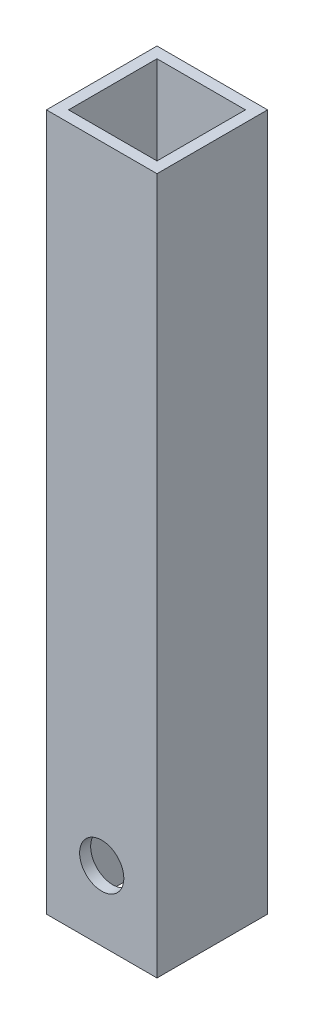
ISO-10303-21;
HEADER;
FILE_DESCRIPTION(('STEP AP214'),'2;1');
FILE_NAME('part.step','',(''),(''),'','','');
FILE_SCHEMA(('AUTOMOTIVE_DESIGN { 1 0 10303 214 1 1 1 1 }'));
ENDSEC;
DATA;
#1=APPLICATION_CONTEXT('core data for automotive mechanical design processes');
#2=APPLICATION_PROTOCOL_DEFINITION('international standard','automotive_design',2000,#1);
#3=PRODUCT_CONTEXT('',#1,'mechanical');
#4=PRODUCT('Part','Part','',(#3));
#5=PRODUCT_RELATED_PRODUCT_CATEGORY('part','',(#4));
#6=PRODUCT_DEFINITION_FORMATION('','',#4);
#7=PRODUCT_DEFINITION_CONTEXT('part definition',#1,'design');
#8=PRODUCT_DEFINITION('design','',#6,#7);
#9=PRODUCT_DEFINITION_SHAPE('','',#8);
#10=(LENGTH_UNIT() NAMED_UNIT(*) SI_UNIT(.MILLI.,.METRE.));
#11=(NAMED_UNIT(*) PLANE_ANGLE_UNIT() SI_UNIT($,.RADIAN.));
#12=(NAMED_UNIT(*) SI_UNIT($,.STERADIAN.) SOLID_ANGLE_UNIT());
#13=UNCERTAINTY_MEASURE_WITH_UNIT(LENGTH_MEASURE(1.E-05),#10,'distance_accuracy_value','');
#14=(GEOMETRIC_REPRESENTATION_CONTEXT(3) GLOBAL_UNCERTAINTY_ASSIGNED_CONTEXT((#13)) GLOBAL_UNIT_ASSIGNED_CONTEXT((#10,
#11,#12)) REPRESENTATION_CONTEXT('',''));
#15=CARTESIAN_POINT('',(0.,0.,0.));
#16=DIRECTION('',(0.,0.,1.));
#17=DIRECTION('',(1.,0.,0.));
#18=AXIS2_PLACEMENT_3D('',#15,#16,#17);
#19=CARTESIAN_POINT('',(1.984375,12.5,-1.984375));
#20=DIRECTION('',(-1.,0.,0.));
#21=DIRECTION('',(0.,0.,1.));
#22=AXIS2_PLACEMENT_3D('',#19,#20,#21);
#23=PLANE('',#22);
#24=DIRECTION('',(0.,0.,-1.));
#25=VECTOR('',#24,1.);
#26=CARTESIAN_POINT('',(1.984375,-12.5,-1.984375));
#27=LINE('',#26,#25);
#28=CARTESIAN_POINT('',(1.984375,-12.5,1.984375));
#29=VERTEX_POINT('',#28);
#30=CARTESIAN_POINT('',(1.984375,-12.5,-1.984375));
#31=VERTEX_POINT('',#30);
#32=EDGE_CURVE('E135',#29,#31,#27,.T.);
#33=ORIENTED_EDGE('',*,*,#32,.T.);
#34=DIRECTION('',(0.,-1.,0.));
#35=VECTOR('',#34,1.);
#36=CARTESIAN_POINT('',(1.984375,12.5,-1.984375));
#37=LINE('',#36,#35);
#38=CARTESIAN_POINT('',(1.984375,12.5,-1.984375));
#39=VERTEX_POINT('',#38);
#40=EDGE_CURVE('E11',#39,#31,#37,.T.);
#41=ORIENTED_EDGE('',*,*,#40,.F.);
#42=DIRECTION('',(0.,0.,-1.));
#43=VECTOR('',#42,1.);
#44=CARTESIAN_POINT('',(1.984375,12.5,-1.984375));
#45=LINE('',#44,#43);
#46=CARTESIAN_POINT('',(1.984375,12.5,1.984375));
#47=VERTEX_POINT('',#46);
#48=EDGE_CURVE('E139',#47,#39,#45,.T.);
#49=ORIENTED_EDGE('',*,*,#48,.F.);
#50=DIRECTION('',(0.,-1.,0.));
#51=VECTOR('',#50,1.);
#52=CARTESIAN_POINT('',(1.984375,12.5,1.984375));
#53=LINE('',#52,#51);
#54=EDGE_CURVE('E149',#47,#29,#53,.T.);
#55=ORIENTED_EDGE('',*,*,#54,.T.);
#56=EDGE_LOOP('',(#33,#41,#49,#55));
#57=FACE_BOUND('',#56,.T.);
#58=ADVANCED_FACE('F34',(#57),#23,.F.);
#59=CARTESIAN_POINT('',(-1.984375,12.5,-1.984375));
#60=DIRECTION('',(0.,0.,1.));
#61=DIRECTION('',(1.,0.,0.));
#62=AXIS2_PLACEMENT_3D('',#59,#60,#61);
#63=PLANE('',#62);
#64=CARTESIAN_POINT('',(0.,-10.,-1.984375));
#65=DIRECTION('',(0.,0.,1.));
#66=DIRECTION('',(1.,0.,0.));
#67=AXIS2_PLACEMENT_3D('',#64,#65,#66);
#68=CIRCLE('',#67,0.79375);
#69=CARTESIAN_POINT('',(0.79375,-10.,-1.984375));
#70=VERTEX_POINT('',#69);
#71=EDGE_CURVE('E226',#70,#70,#68,.T.);
#72=ORIENTED_EDGE('',*,*,#71,.T.);
#73=EDGE_LOOP('',(#72));
#74=FACE_BOUND('',#73,.T.);
#75=DIRECTION('',(-1.,0.,0.));
#76=VECTOR('',#75,1.);
#77=CARTESIAN_POINT('',(-1.984375,-12.5,-1.984375));
#78=LINE('',#77,#76);
#79=CARTESIAN_POINT('',(-1.984375,-12.5,-1.984375));
#80=VERTEX_POINT('',#79);
#81=EDGE_CURVE('E152',#31,#80,#78,.T.);
#82=ORIENTED_EDGE('',*,*,#81,.T.);
#83=DIRECTION('',(0.,-1.,0.));
#84=VECTOR('',#83,1.);
#85=CARTESIAN_POINT('',(-1.984375,12.5,-1.984375));
#86=LINE('',#85,#84);
#87=CARTESIAN_POINT('',(-1.984375,12.5,-1.984375));
#88=VERTEX_POINT('',#87);
#89=EDGE_CURVE('E42',#88,#80,#86,.T.);
#90=ORIENTED_EDGE('',*,*,#89,.F.);
#91=DIRECTION('',(-1.,0.,0.));
#92=VECTOR('',#91,1.);
#93=CARTESIAN_POINT('',(-1.984375,12.5,-1.984375));
#94=LINE('',#93,#92);
#95=EDGE_CURVE('E142',#39,#88,#94,.T.);
#96=ORIENTED_EDGE('',*,*,#95,.F.);
#97=ORIENTED_EDGE('',*,*,#40,.T.);
#98=EDGE_LOOP('',(#82,#90,#96,#97));
#99=FACE_BOUND('',#98,.T.);
#100=ADVANCED_FACE('F181',(#74,#99),#63,.F.);
#101=CARTESIAN_POINT('',(-1.984375,12.5,-1.984375));
#102=DIRECTION('',(1.,0.,0.));
#103=DIRECTION('',(0.,0.,-1.));
#104=AXIS2_PLACEMENT_3D('',#101,#102,#103);
#105=PLANE('',#104);
#106=DIRECTION('',(0.,0.,1.));
#107=VECTOR('',#106,1.);
#108=CARTESIAN_POINT('',(-1.984375,-12.5,-1.984375));
#109=LINE('',#108,#107);
#110=CARTESIAN_POINT('',(-1.984375,-12.5,1.984375));
#111=VERTEX_POINT('',#110);
#112=EDGE_CURVE('E154',#80,#111,#109,.T.);
#113=ORIENTED_EDGE('',*,*,#112,.T.);
#114=DIRECTION('',(0.,-1.,0.));
#115=VECTOR('',#114,1.);
#116=CARTESIAN_POINT('',(-1.984375,12.5,1.984375));
#117=LINE('',#116,#115);
#118=CARTESIAN_POINT('',(-1.984375,12.5,1.984375));
#119=VERTEX_POINT('',#118);
#120=EDGE_CURVE('E159',#119,#111,#117,.T.);
#121=ORIENTED_EDGE('',*,*,#120,.F.);
#122=DIRECTION('',(0.,0.,1.));
#123=VECTOR('',#122,1.);
#124=CARTESIAN_POINT('',(-1.984375,12.5,-1.984375));
#125=LINE('',#124,#123);
#126=EDGE_CURVE('E145',#88,#119,#125,.T.);
#127=ORIENTED_EDGE('',*,*,#126,.F.);
#128=ORIENTED_EDGE('',*,*,#89,.T.);
#129=EDGE_LOOP('',(#113,#121,#127,#128));
#130=FACE_BOUND('',#129,.T.);
#131=ADVANCED_FACE('F167',(#130),#105,.F.);
#132=CARTESIAN_POINT('',(-1.984375,12.5,1.984375));
#133=DIRECTION('',(0.,0.,-1.));
#134=DIRECTION('',(-1.,0.,0.));
#135=AXIS2_PLACEMENT_3D('',#132,#133,#134);
#136=PLANE('',#135);
#137=CARTESIAN_POINT('',(0.,-10.,1.984375));
#138=DIRECTION('',(0.,0.,1.));
#139=DIRECTION('',(1.,0.,0.));
#140=AXIS2_PLACEMENT_3D('',#137,#138,#139);
#141=CIRCLE('',#140,0.79375);
#142=CARTESIAN_POINT('',(0.79375,-10.,1.984375));
#143=VERTEX_POINT('',#142);
#144=EDGE_CURVE('E222',#143,#143,#141,.T.);
#145=ORIENTED_EDGE('',*,*,#144,.F.);
#146=EDGE_LOOP('',(#145));
#147=FACE_BOUND('',#146,.T.);
#148=DIRECTION('',(1.,0.,0.));
#149=VECTOR('',#148,1.);
#150=CARTESIAN_POINT('',(-1.984375,-12.5,1.984375));
#151=LINE('',#150,#149);
#152=EDGE_CURVE('E143',#111,#29,#151,.T.);
#153=ORIENTED_EDGE('',*,*,#152,.T.);
#154=ORIENTED_EDGE('',*,*,#54,.F.);
#155=DIRECTION('',(1.,0.,0.));
#156=VECTOR('',#155,1.);
#157=CARTESIAN_POINT('',(-1.984375,12.5,1.984375));
#158=LINE('',#157,#156);
#159=EDGE_CURVE('E147',#119,#47,#158,.T.);
#160=ORIENTED_EDGE('',*,*,#159,.F.);
#161=ORIENTED_EDGE('',*,*,#120,.T.);
#162=EDGE_LOOP('',(#153,#154,#160,#161));
#163=FACE_BOUND('',#162,.T.);
#164=ADVANCED_FACE('F174',(#147,#163),#136,.F.);
#165=CARTESIAN_POINT('',(0.,12.5,0.));
#166=DIRECTION('',(0.,1.,0.));
#167=DIRECTION('',(0.,0.,1.));
#168=AXIS2_PLACEMENT_3D('',#165,#166,#167);
#169=PLANE('',#168);
#170=DIRECTION('',(0.,0.,-1.));
#171=VECTOR('',#170,1.);
#172=CARTESIAN_POINT('',(1.5875,12.5,-1.5875));
#173=LINE('',#172,#171);
#174=CARTESIAN_POINT('',(1.5875,12.5,1.5875));
#175=VERTEX_POINT('',#174);
#176=CARTESIAN_POINT('',(1.5875,12.5,-1.5875));
#177=VERTEX_POINT('',#176);
#178=EDGE_CURVE('E49',#175,#177,#173,.T.);
#179=ORIENTED_EDGE('',*,*,#178,.F.);
#180=DIRECTION('',(1.,0.,0.));
#181=VECTOR('',#180,1.);
#182=CARTESIAN_POINT('',(-1.5875,12.5,1.5875));
#183=LINE('',#182,#181);
#184=CARTESIAN_POINT('',(-1.5875,12.5,1.5875));
#185=VERTEX_POINT('',#184);
#186=EDGE_CURVE('E117',#185,#175,#183,.T.);
#187=ORIENTED_EDGE('',*,*,#186,.F.);
#188=DIRECTION('',(0.,0.,1.));
#189=VECTOR('',#188,1.);
#190=CARTESIAN_POINT('',(-1.5875,12.5,-1.5875));
#191=LINE('',#190,#189);
#192=CARTESIAN_POINT('',(-1.5875,12.5,-1.5875));
#193=VERTEX_POINT('',#192);
#194=EDGE_CURVE('E120',#193,#185,#191,.T.);
#195=ORIENTED_EDGE('',*,*,#194,.F.);
#196=DIRECTION('',(-1.,0.,0.));
#197=VECTOR('',#196,1.);
#198=CARTESIAN_POINT('',(-1.5875,12.5,-1.5875));
#199=LINE('',#198,#197);
#200=EDGE_CURVE('E129',#177,#193,#199,.T.);
#201=ORIENTED_EDGE('',*,*,#200,.F.);
#202=EDGE_LOOP('',(#179,#187,#195,#201));
#203=FACE_BOUND('',#202,.T.);
#204=ORIENTED_EDGE('',*,*,#48,.T.);
#205=ORIENTED_EDGE('',*,*,#95,.T.);
#206=ORIENTED_EDGE('',*,*,#126,.T.);
#207=ORIENTED_EDGE('',*,*,#159,.T.);
#208=EDGE_LOOP('',(#204,#205,#206,#207));
#209=FACE_BOUND('',#208,.T.);
#210=ADVANCED_FACE('F180',(#203,#209),#169,.T.);
#211=CARTESIAN_POINT('',(0.,-12.5,0.));
#212=DIRECTION('',(0.,1.,0.));
#213=DIRECTION('',(0.,0.,1.));
#214=AXIS2_PLACEMENT_3D('',#211,#212,#213);
#215=PLANE('',#214);
#216=DIRECTION('',(1.,0.,0.));
#217=VECTOR('',#216,1.);
#218=CARTESIAN_POINT('',(-1.5875,-12.5,1.5875));
#219=LINE('',#218,#217);
#220=CARTESIAN_POINT('',(-1.5875,-12.5,1.5875));
#221=VERTEX_POINT('',#220);
#222=CARTESIAN_POINT('',(1.5875,-12.5,1.5875));
#223=VERTEX_POINT('',#222);
#224=EDGE_CURVE('E107',#221,#223,#219,.T.);
#225=ORIENTED_EDGE('',*,*,#224,.T.);
#226=DIRECTION('',(0.,0.,-1.));
#227=VECTOR('',#226,1.);
#228=CARTESIAN_POINT('',(1.5875,-12.5,-1.5875));
#229=LINE('',#228,#227);
#230=CARTESIAN_POINT('',(1.5875,-12.5,-1.5875));
#231=VERTEX_POINT('',#230);
#232=EDGE_CURVE('E101',#223,#231,#229,.T.);
#233=ORIENTED_EDGE('',*,*,#232,.T.);
#234=DIRECTION('',(-1.,0.,0.));
#235=VECTOR('',#234,1.);
#236=CARTESIAN_POINT('',(-1.5875,-12.5,-1.5875));
#237=LINE('',#236,#235);
#238=CARTESIAN_POINT('',(-1.5875,-12.5,-1.5875));
#239=VERTEX_POINT('',#238);
#240=EDGE_CURVE('E110',#231,#239,#237,.T.);
#241=ORIENTED_EDGE('',*,*,#240,.T.);
#242=DIRECTION('',(0.,0.,1.));
#243=VECTOR('',#242,1.);
#244=CARTESIAN_POINT('',(-1.5875,-12.5,-1.5875));
#245=LINE('',#244,#243);
#246=EDGE_CURVE('E57',#239,#221,#245,.T.);
#247=ORIENTED_EDGE('',*,*,#246,.T.);
#248=EDGE_LOOP('',(#225,#233,#241,#247));
#249=FACE_BOUND('',#248,.T.);
#250=ORIENTED_EDGE('',*,*,#32,.F.);
#251=ORIENTED_EDGE('',*,*,#152,.F.);
#252=ORIENTED_EDGE('',*,*,#112,.F.);
#253=ORIENTED_EDGE('',*,*,#81,.F.);
#254=EDGE_LOOP('',(#250,#251,#252,#253));
#255=FACE_BOUND('',#254,.T.);
#256=ADVANCED_FACE('F114',(#249,#255),#215,.F.);
#257=CARTESIAN_POINT('',(1.5875,-12.5,-1.5875));
#258=DIRECTION('',(1.,0.,0.));
#259=DIRECTION('',(0.,0.,-1.));
#260=AXIS2_PLACEMENT_3D('',#257,#258,#259);
#261=PLANE('',#260);
#262=ORIENTED_EDGE('',*,*,#178,.T.);
#263=DIRECTION('',(0.,1.,0.));
#264=VECTOR('',#263,1.);
#265=CARTESIAN_POINT('',(1.5875,-12.5,-1.5875));
#266=LINE('',#265,#264);
#267=EDGE_CURVE('E97',#231,#177,#266,.T.);
#268=ORIENTED_EDGE('',*,*,#267,.F.);
#269=ORIENTED_EDGE('',*,*,#232,.F.);
#270=DIRECTION('',(0.,1.,0.));
#271=VECTOR('',#270,1.);
#272=CARTESIAN_POINT('',(1.5875,-12.5,1.5875));
#273=LINE('',#272,#271);
#274=EDGE_CURVE('E133',#223,#175,#273,.T.);
#275=ORIENTED_EDGE('',*,*,#274,.T.);
#276=EDGE_LOOP('',(#262,#268,#269,#275));
#277=FACE_BOUND('',#276,.T.);
#278=ADVANCED_FACE('F99',(#277),#261,.F.);
#279=CARTESIAN_POINT('',(-1.5875,-12.5,1.5875));
#280=DIRECTION('',(0.,0.,1.));
#281=DIRECTION('',(1.,0.,0.));
#282=AXIS2_PLACEMENT_3D('',#279,#280,#281);
#283=PLANE('',#282);
#284=CARTESIAN_POINT('',(0.,-10.,1.5875));
#285=DIRECTION('',(0.,0.,1.));
#286=DIRECTION('',(1.,0.,0.));
#287=AXIS2_PLACEMENT_3D('',#284,#285,#286);
#288=CIRCLE('',#287,0.79375);
#289=CARTESIAN_POINT('',(0.79375,-10.,1.5875));
#290=VERTEX_POINT('',#289);
#291=EDGE_CURVE('E123',#290,#290,#288,.T.);
#292=ORIENTED_EDGE('',*,*,#291,.T.);
#293=EDGE_LOOP('',(#292));
#294=FACE_BOUND('',#293,.T.);
#295=ORIENTED_EDGE('',*,*,#186,.T.);
#296=ORIENTED_EDGE('',*,*,#274,.F.);
#297=ORIENTED_EDGE('',*,*,#224,.F.);
#298=DIRECTION('',(0.,1.,0.));
#299=VECTOR('',#298,1.);
#300=CARTESIAN_POINT('',(-1.5875,-12.5,1.5875));
#301=LINE('',#300,#299);
#302=EDGE_CURVE('E136',#221,#185,#301,.T.);
#303=ORIENTED_EDGE('',*,*,#302,.T.);
#304=EDGE_LOOP('',(#295,#296,#297,#303));
#305=FACE_BOUND('',#304,.T.);
#306=ADVANCED_FACE('F201',(#294,#305),#283,.F.);
#307=CARTESIAN_POINT('',(-1.5875,-12.5,-1.5875));
#308=DIRECTION('',(-1.,0.,0.));
#309=DIRECTION('',(0.,0.,1.));
#310=AXIS2_PLACEMENT_3D('',#307,#308,#309);
#311=PLANE('',#310);
#312=ORIENTED_EDGE('',*,*,#194,.T.);
#313=ORIENTED_EDGE('',*,*,#302,.F.);
#314=ORIENTED_EDGE('',*,*,#246,.F.);
#315=DIRECTION('',(0.,1.,0.));
#316=VECTOR('',#315,1.);
#317=CARTESIAN_POINT('',(-1.5875,-12.5,-1.5875));
#318=LINE('',#317,#316);
#319=EDGE_CURVE('E106',#239,#193,#318,.T.);
#320=ORIENTED_EDGE('',*,*,#319,.T.);
#321=EDGE_LOOP('',(#312,#313,#314,#320));
#322=FACE_BOUND('',#321,.T.);
#323=ADVANCED_FACE('F205',(#322),#311,.F.);
#324=CARTESIAN_POINT('',(-1.5875,-12.5,-1.5875));
#325=DIRECTION('',(0.,0.,-1.));
#326=DIRECTION('',(-1.,0.,0.));
#327=AXIS2_PLACEMENT_3D('',#324,#325,#326);
#328=PLANE('',#327);
#329=CARTESIAN_POINT('',(0.,-10.,-1.5875));
#330=DIRECTION('',(0.,0.,-1.));
#331=DIRECTION('',(-1.,0.,0.));
#332=AXIS2_PLACEMENT_3D('',#329,#330,#331);
#333=CIRCLE('',#332,0.79375);
#334=CARTESIAN_POINT('',(-0.79375,-10.,-1.5875));
#335=VERTEX_POINT('',#334);
#336=EDGE_CURVE('E37',#335,#335,#333,.T.);
#337=ORIENTED_EDGE('',*,*,#336,.T.);
#338=EDGE_LOOP('',(#337));
#339=FACE_BOUND('',#338,.T.);
#340=ORIENTED_EDGE('',*,*,#200,.T.);
#341=ORIENTED_EDGE('',*,*,#319,.F.);
#342=ORIENTED_EDGE('',*,*,#240,.F.);
#343=ORIENTED_EDGE('',*,*,#267,.T.);
#344=EDGE_LOOP('',(#340,#341,#342,#343));
#345=FACE_BOUND('',#344,.T.);
#346=ADVANCED_FACE('F111',(#339,#345),#328,.F.);
#347=CARTESIAN_POINT('',(0.,-10.,-1.984375));
#348=DIRECTION('',(0.,0.,1.));
#349=DIRECTION('',(1.,0.,0.));
#350=AXIS2_PLACEMENT_3D('',#347,#348,#349);
#351=CYLINDRICAL_SURFACE('',#350,0.79375);
#352=ORIENTED_EDGE('',*,*,#71,.F.);
#353=EDGE_LOOP('',(#352));
#354=FACE_BOUND('',#353,.T.);
#355=ORIENTED_EDGE('',*,*,#336,.F.);
#356=EDGE_LOOP('',(#355));
#357=FACE_BOUND('',#356,.T.);
#358=ADVANCED_FACE('F204',(#354,#357),#351,.F.);
#359=ORIENTED_EDGE('',*,*,#144,.T.);
#360=EDGE_LOOP('',(#359));
#361=FACE_BOUND('',#360,.T.);
#362=ORIENTED_EDGE('',*,*,#291,.F.);
#363=EDGE_LOOP('',(#362));
#364=FACE_BOUND('',#363,.T.);
#365=ADVANCED_FACE('F212',(#361,#364),#351,.F.);
#366=CLOSED_SHELL('',(#58,#100,#131,#164,#210,#256,#278,#306,#323,#346,#358,#365));
#367=MANIFOLD_SOLID_BREP('B2',#366);
#368=ADVANCED_BREP_SHAPE_REPRESENTATION('',(#18,#367),#14);
#369=SHAPE_DEFINITION_REPRESENTATION(#9,#368);
ENDSEC;
END-ISO-10303-21;
